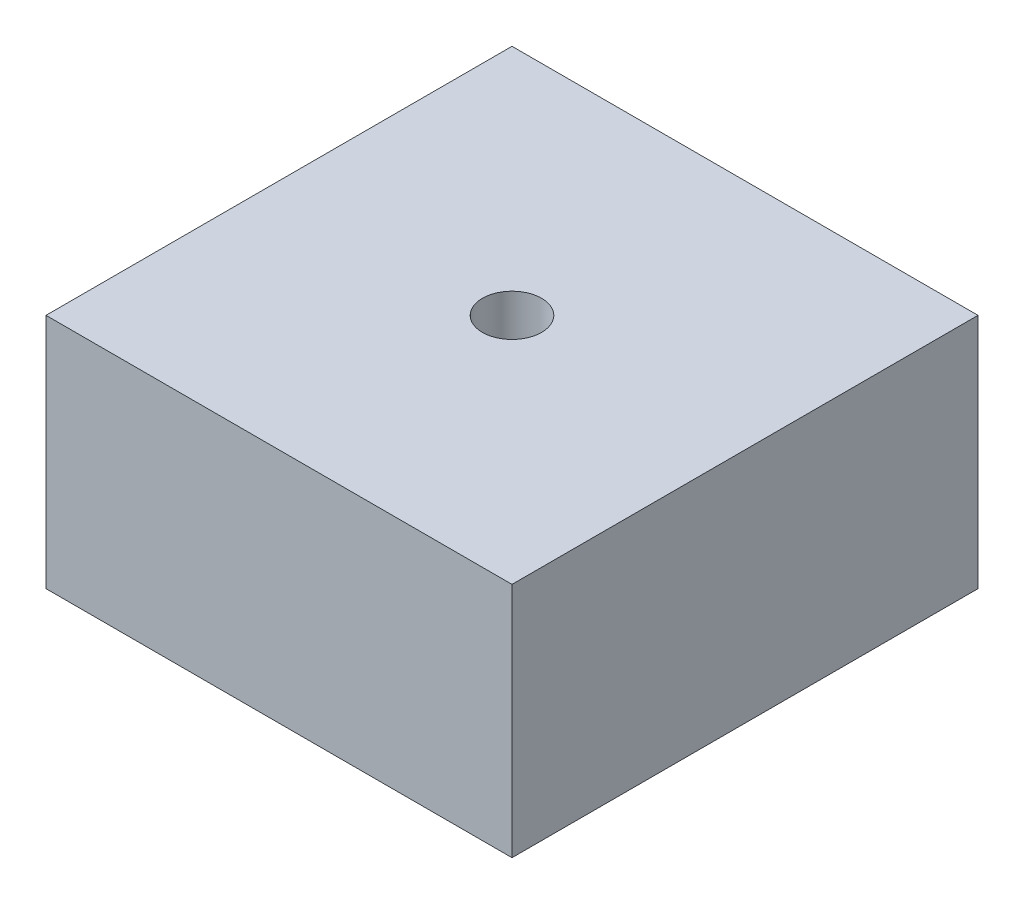
ISO-10303-21;
HEADER;
FILE_DESCRIPTION(('STEP AP214'),'2;1');
FILE_NAME('part.step','',(''),(''),'','','');
FILE_SCHEMA(('AUTOMOTIVE_DESIGN { 1 0 10303 214 1 1 1 1 }'));
ENDSEC;
DATA;
#1=APPLICATION_CONTEXT('core data for automotive mechanical design processes');
#2=APPLICATION_PROTOCOL_DEFINITION('international standard','automotive_design',2000,#1);
#3=PRODUCT_CONTEXT('',#1,'mechanical');
#4=PRODUCT('Part','Part','',(#3));
#5=PRODUCT_RELATED_PRODUCT_CATEGORY('part','',(#4));
#6=PRODUCT_DEFINITION_FORMATION('','',#4);
#7=PRODUCT_DEFINITION_CONTEXT('part definition',#1,'design');
#8=PRODUCT_DEFINITION('design','',#6,#7);
#9=PRODUCT_DEFINITION_SHAPE('','',#8);
#10=(LENGTH_UNIT() NAMED_UNIT(*) SI_UNIT(.MILLI.,.METRE.));
#11=(NAMED_UNIT(*) PLANE_ANGLE_UNIT() SI_UNIT($,.RADIAN.));
#12=(NAMED_UNIT(*) SI_UNIT($,.STERADIAN.) SOLID_ANGLE_UNIT());
#13=UNCERTAINTY_MEASURE_WITH_UNIT(LENGTH_MEASURE(1.E-05),#10,'distance_accuracy_value','');
#14=(GEOMETRIC_REPRESENTATION_CONTEXT(3) GLOBAL_UNCERTAINTY_ASSIGNED_CONTEXT((#13)) GLOBAL_UNIT_ASSIGNED_CONTEXT((#10,
#11,#12)) REPRESENTATION_CONTEXT('',''));
#15=CARTESIAN_POINT('',(0.,0.,0.));
#16=DIRECTION('',(0.,0.,1.));
#17=DIRECTION('',(1.,0.,0.));
#18=AXIS2_PLACEMENT_3D('',#15,#16,#17);
#19=CARTESIAN_POINT('',(12.5,6.35,-12.5));
#20=DIRECTION('',(-1.,0.,0.));
#21=DIRECTION('',(0.,0.,1.));
#22=AXIS2_PLACEMENT_3D('',#19,#20,#21);
#23=PLANE('',#22);
#24=DIRECTION('',(0.,0.,-1.));
#25=VECTOR('',#24,1.);
#26=CARTESIAN_POINT('',(12.5,-6.35,-12.5));
#27=LINE('',#26,#25);
#28=CARTESIAN_POINT('',(12.5,-6.35,12.5));
#29=VERTEX_POINT('',#28);
#30=CARTESIAN_POINT('',(12.5,-6.35,-12.5));
#31=VERTEX_POINT('',#30);
#32=EDGE_CURVE('E98',#29,#31,#27,.T.);
#33=ORIENTED_EDGE('',*,*,#32,.T.);
#34=DIRECTION('',(0.,-1.,0.));
#35=VECTOR('',#34,1.);
#36=CARTESIAN_POINT('',(12.5,6.35,-12.5));
#37=LINE('',#36,#35);
#38=CARTESIAN_POINT('',(12.5,6.35,-12.5));
#39=VERTEX_POINT('',#38);
#40=EDGE_CURVE('E11',#39,#31,#37,.T.);
#41=ORIENTED_EDGE('',*,*,#40,.F.);
#42=DIRECTION('',(0.,0.,-1.));
#43=VECTOR('',#42,1.);
#44=CARTESIAN_POINT('',(12.5,6.35,-12.5));
#45=LINE('',#44,#43);
#46=CARTESIAN_POINT('',(12.5,6.35,12.5));
#47=VERTEX_POINT('',#46);
#48=EDGE_CURVE('E86',#47,#39,#45,.T.);
#49=ORIENTED_EDGE('',*,*,#48,.F.);
#50=DIRECTION('',(0.,-1.,0.));
#51=VECTOR('',#50,1.);
#52=CARTESIAN_POINT('',(12.5,6.35,12.5));
#53=LINE('',#52,#51);
#54=EDGE_CURVE('E94',#47,#29,#53,.T.);
#55=ORIENTED_EDGE('',*,*,#54,.T.);
#56=EDGE_LOOP('',(#33,#41,#49,#55));
#57=FACE_BOUND('',#56,.T.);
#58=ADVANCED_FACE('F35',(#57),#23,.F.);
#59=CARTESIAN_POINT('',(-12.5,6.35,-12.5));
#60=DIRECTION('',(0.,0.,1.));
#61=DIRECTION('',(1.,0.,0.));
#62=AXIS2_PLACEMENT_3D('',#59,#60,#61);
#63=PLANE('',#62);
#64=DIRECTION('',(-1.,0.,0.));
#65=VECTOR('',#64,1.);
#66=CARTESIAN_POINT('',(-12.5,-6.35,-12.5));
#67=LINE('',#66,#65);
#68=CARTESIAN_POINT('',(-12.5,-6.35,-12.5));
#69=VERTEX_POINT('',#68);
#70=EDGE_CURVE('E90',#31,#69,#67,.T.);
#71=ORIENTED_EDGE('',*,*,#70,.T.);
#72=DIRECTION('',(0.,-1.,0.));
#73=VECTOR('',#72,1.);
#74=CARTESIAN_POINT('',(-12.5,6.35,-12.5));
#75=LINE('',#74,#73);
#76=CARTESIAN_POINT('',(-12.5,6.35,-12.5));
#77=VERTEX_POINT('',#76);
#78=EDGE_CURVE('E43',#77,#69,#75,.T.);
#79=ORIENTED_EDGE('',*,*,#78,.F.);
#80=DIRECTION('',(-1.,0.,0.));
#81=VECTOR('',#80,1.);
#82=CARTESIAN_POINT('',(-12.5,6.35,-12.5));
#83=LINE('',#82,#81);
#84=EDGE_CURVE('E81',#39,#77,#83,.T.);
#85=ORIENTED_EDGE('',*,*,#84,.F.);
#86=ORIENTED_EDGE('',*,*,#40,.T.);
#87=EDGE_LOOP('',(#71,#79,#85,#86));
#88=FACE_BOUND('',#87,.T.);
#89=ADVANCED_FACE('F89',(#88),#63,.F.);
#90=CARTESIAN_POINT('',(-12.5,6.35,-12.5));
#91=DIRECTION('',(1.,0.,0.));
#92=DIRECTION('',(0.,0.,-1.));
#93=AXIS2_PLACEMENT_3D('',#90,#91,#92);
#94=PLANE('',#93);
#95=DIRECTION('',(0.,0.,1.));
#96=VECTOR('',#95,1.);
#97=CARTESIAN_POINT('',(-12.5,-6.35,-12.5));
#98=LINE('',#97,#96);
#99=CARTESIAN_POINT('',(-12.5,-6.35,12.5));
#100=VERTEX_POINT('',#99);
#101=EDGE_CURVE('E68',#69,#100,#98,.T.);
#102=ORIENTED_EDGE('',*,*,#101,.T.);
#103=DIRECTION('',(0.,-1.,0.));
#104=VECTOR('',#103,1.);
#105=CARTESIAN_POINT('',(-12.5,6.35,12.5));
#106=LINE('',#105,#104);
#107=CARTESIAN_POINT('',(-12.5,6.35,12.5));
#108=VERTEX_POINT('',#107);
#109=EDGE_CURVE('E91',#108,#100,#106,.T.);
#110=ORIENTED_EDGE('',*,*,#109,.F.);
#111=DIRECTION('',(0.,0.,1.));
#112=VECTOR('',#111,1.);
#113=CARTESIAN_POINT('',(-12.5,6.35,-12.5));
#114=LINE('',#113,#112);
#115=EDGE_CURVE('E84',#77,#108,#114,.T.);
#116=ORIENTED_EDGE('',*,*,#115,.F.);
#117=ORIENTED_EDGE('',*,*,#78,.T.);
#118=EDGE_LOOP('',(#102,#110,#116,#117));
#119=FACE_BOUND('',#118,.T.);
#120=ADVANCED_FACE('F92',(#119),#94,.F.);
#121=CARTESIAN_POINT('',(-12.5,6.35,12.5));
#122=DIRECTION('',(0.,0.,-1.));
#123=DIRECTION('',(-1.,0.,0.));
#124=AXIS2_PLACEMENT_3D('',#121,#122,#123);
#125=PLANE('',#124);
#126=DIRECTION('',(1.,0.,0.));
#127=VECTOR('',#126,1.);
#128=CARTESIAN_POINT('',(-12.5,-6.35,12.5));
#129=LINE('',#128,#127);
#130=EDGE_CURVE('E74',#100,#29,#129,.T.);
#131=ORIENTED_EDGE('',*,*,#130,.T.);
#132=ORIENTED_EDGE('',*,*,#54,.F.);
#133=DIRECTION('',(1.,0.,0.));
#134=VECTOR('',#133,1.);
#135=CARTESIAN_POINT('',(-12.5,6.35,12.5));
#136=LINE('',#135,#134);
#137=EDGE_CURVE('E51',#108,#47,#136,.T.);
#138=ORIENTED_EDGE('',*,*,#137,.F.);
#139=ORIENTED_EDGE('',*,*,#109,.T.);
#140=EDGE_LOOP('',(#131,#132,#138,#139));
#141=FACE_BOUND('',#140,.T.);
#142=ADVANCED_FACE('F106',(#141),#125,.F.);
#143=CARTESIAN_POINT('',(0.,6.35,0.));
#144=DIRECTION('',(0.,1.,0.));
#145=DIRECTION('',(0.,0.,1.));
#146=AXIS2_PLACEMENT_3D('',#143,#144,#145);
#147=PLANE('',#146);
#148=CARTESIAN_POINT('',(0.,6.35,0.));
#149=DIRECTION('',(0.,1.,0.));
#150=DIRECTION('',(0.,0.,1.));
#151=AXIS2_PLACEMENT_3D('',#148,#149,#150);
#152=CIRCLE('',#151,1.5875);
#153=CARTESIAN_POINT('',(0.,6.35,1.5875));
#154=VERTEX_POINT('',#153);
#155=EDGE_CURVE('E112',#154,#154,#152,.T.);
#156=ORIENTED_EDGE('',*,*,#155,.F.);
#157=EDGE_LOOP('',(#156));
#158=FACE_BOUND('',#157,.T.);
#159=ORIENTED_EDGE('',*,*,#48,.T.);
#160=ORIENTED_EDGE('',*,*,#84,.T.);
#161=ORIENTED_EDGE('',*,*,#115,.T.);
#162=ORIENTED_EDGE('',*,*,#137,.T.);
#163=EDGE_LOOP('',(#159,#160,#161,#162));
#164=FACE_BOUND('',#163,.T.);
#165=ADVANCED_FACE('F82',(#158,#164),#147,.T.);
#166=CARTESIAN_POINT('',(0.,-6.35,0.));
#167=DIRECTION('',(0.,1.,0.));
#168=DIRECTION('',(0.,0.,1.));
#169=AXIS2_PLACEMENT_3D('',#166,#167,#168);
#170=PLANE('',#169);
#171=CARTESIAN_POINT('',(0.,-6.35,0.));
#172=DIRECTION('',(0.,1.,0.));
#173=DIRECTION('',(0.,0.,1.));
#174=AXIS2_PLACEMENT_3D('',#171,#172,#173);
#175=CIRCLE('',#174,1.5875);
#176=CARTESIAN_POINT('',(0.,-6.35,1.5875));
#177=VERTEX_POINT('',#176);
#178=EDGE_CURVE('E101',#177,#177,#175,.T.);
#179=ORIENTED_EDGE('',*,*,#178,.T.);
#180=EDGE_LOOP('',(#179));
#181=FACE_BOUND('',#180,.T.);
#182=ORIENTED_EDGE('',*,*,#32,.F.);
#183=ORIENTED_EDGE('',*,*,#130,.F.);
#184=ORIENTED_EDGE('',*,*,#101,.F.);
#185=ORIENTED_EDGE('',*,*,#70,.F.);
#186=EDGE_LOOP('',(#182,#183,#184,#185));
#187=FACE_BOUND('',#186,.T.);
#188=ADVANCED_FACE('F109',(#181,#187),#170,.F.);
#189=CARTESIAN_POINT('',(0.,-6.35,0.));
#190=DIRECTION('',(0.,1.,0.));
#191=DIRECTION('',(0.,0.,1.));
#192=AXIS2_PLACEMENT_3D('',#189,#190,#191);
#193=CYLINDRICAL_SURFACE('',#192,1.5875);
#194=ORIENTED_EDGE('',*,*,#178,.F.);
#195=EDGE_LOOP('',(#194));
#196=FACE_BOUND('',#195,.T.);
#197=ORIENTED_EDGE('',*,*,#155,.T.);
#198=EDGE_LOOP('',(#197));
#199=FACE_BOUND('',#198,.T.);
#200=ADVANCED_FACE('F119',(#196,#199),#193,.F.);
#201=CLOSED_SHELL('',(#58,#89,#120,#142,#165,#188,#200));
#202=MANIFOLD_SOLID_BREP('B2',#201);
#203=ADVANCED_BREP_SHAPE_REPRESENTATION('',(#18,#202),#14);
#204=SHAPE_DEFINITION_REPRESENTATION(#9,#203);
ENDSEC;
END-ISO-10303-21;
